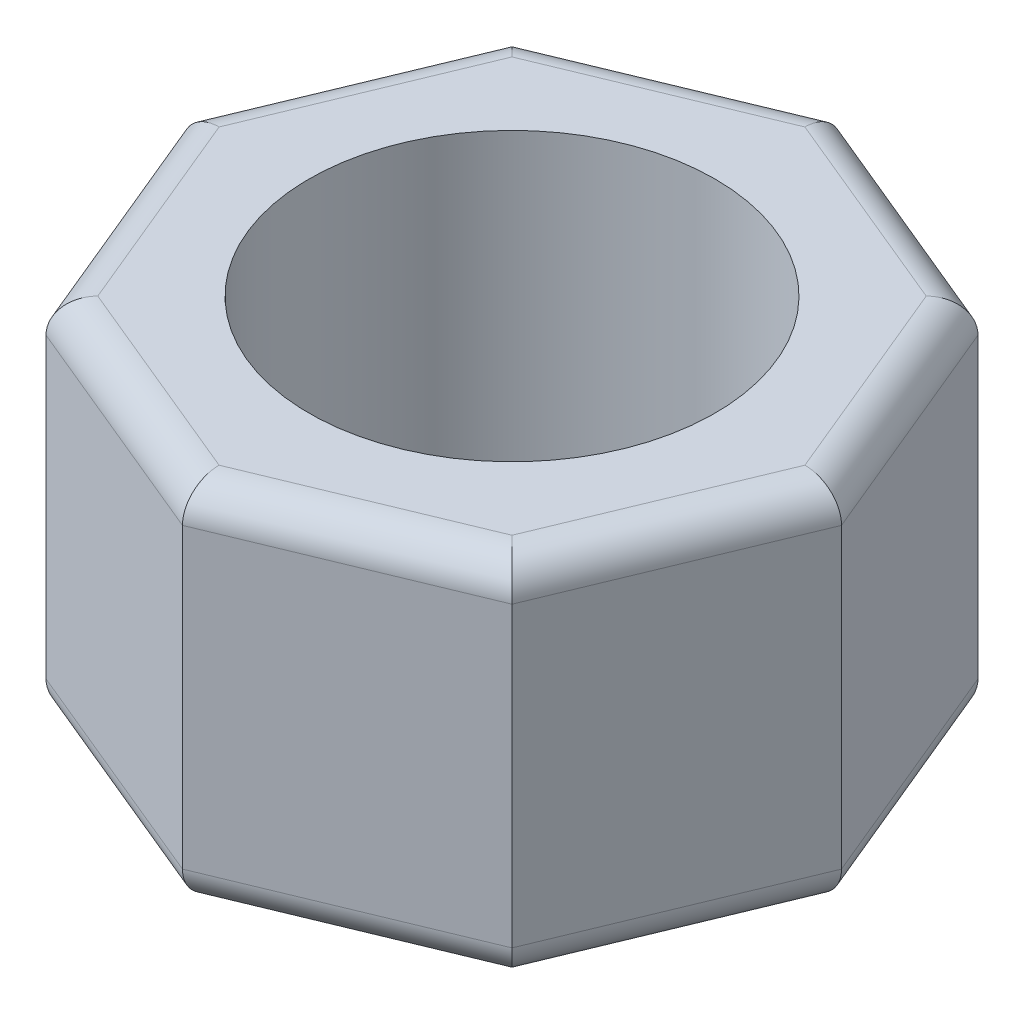
ISO-10303-21;
HEADER;
FILE_DESCRIPTION(('STEP AP214'),'2;1');
FILE_NAME('part.step','',(''),(''),'','','');
FILE_SCHEMA(('AUTOMOTIVE_DESIGN { 1 0 10303 214 1 1 1 1 }'));
ENDSEC;
DATA;
#1=APPLICATION_CONTEXT('core data for automotive mechanical design processes');
#2=APPLICATION_PROTOCOL_DEFINITION('international standard','automotive_design',2000,#1);
#3=PRODUCT_CONTEXT('',#1,'mechanical');
#4=PRODUCT('Part','Part','',(#3));
#5=PRODUCT_RELATED_PRODUCT_CATEGORY('part','',(#4));
#6=PRODUCT_DEFINITION_FORMATION('','',#4);
#7=PRODUCT_DEFINITION_CONTEXT('part definition',#1,'design');
#8=PRODUCT_DEFINITION('design','',#6,#7);
#9=PRODUCT_DEFINITION_SHAPE('','',#8);
#10=(LENGTH_UNIT() NAMED_UNIT(*) SI_UNIT(.MILLI.,.METRE.));
#11=(NAMED_UNIT(*) PLANE_ANGLE_UNIT() SI_UNIT($,.RADIAN.));
#12=(NAMED_UNIT(*) SI_UNIT($,.STERADIAN.) SOLID_ANGLE_UNIT());
#13=UNCERTAINTY_MEASURE_WITH_UNIT(LENGTH_MEASURE(1.E-05),#10,'distance_accuracy_value','');
#14=(GEOMETRIC_REPRESENTATION_CONTEXT(3) GLOBAL_UNCERTAINTY_ASSIGNED_CONTEXT((#13)) GLOBAL_UNIT_ASSIGNED_CONTEXT((#10,
#11,#12)) REPRESENTATION_CONTEXT('',''));
#15=CARTESIAN_POINT('',(0.,0.,0.));
#16=DIRECTION('',(0.,0.,1.));
#17=DIRECTION('',(1.,0.,0.));
#18=AXIS2_PLACEMENT_3D('',#15,#16,#17);
#19=CARTESIAN_POINT('',(0.,10.8,0.));
#20=DIRECTION('',(0.,1.,0.));
#21=DIRECTION('',(0.,0.,1.));
#22=AXIS2_PLACEMENT_3D('',#19,#20,#21);
#23=PLANE('',#22);
#24=DIRECTION('',(0.923879532511292,0.,0.382683432365078));
#25=VECTOR('',#24,1.);
#26=CARTESIAN_POINT('',(0.3826834323652,10.8,8.81765027012026));
#27=LINE('',#26,#25);
#28=CARTESIAN_POINT('',(-6.12293491784136,10.8,6.12293491784151));
#29=VERTEX_POINT('',#28);
#30=CARTESIAN_POINT('',(1.09675449512584E-13,10.8,8.65913760233915));
#31=VERTEX_POINT('',#30);
#32=EDGE_CURVE('E170',#29,#31,#27,.T.);
#33=ORIENTED_EDGE('',*,*,#32,.T.);
#34=DIRECTION('',(0.923879532511282,0.,-0.382683432365101));
#35=VECTOR('',#34,1.);
#36=CARTESIAN_POINT('',(6.5056183502066,10.8,5.96442225006025));
#37=LINE('',#36,#35);
#38=CARTESIAN_POINT('',(6.1229349178415,10.8,6.12293491784137));
#39=VERTEX_POINT('',#38);
#40=EDGE_CURVE('E151',#31,#39,#37,.T.);
#41=ORIENTED_EDGE('',*,*,#40,.T.);
#42=DIRECTION('',(0.382683432365079,0.,-0.923879532511291));
#43=VECTOR('',#42,1.);
#44=CARTESIAN_POINT('',(8.81765027012026,10.8,-0.382683432365206));
#45=LINE('',#44,#43);
#46=CARTESIAN_POINT('',(8.65913760233915,10.8,-1.0994775155675E-13));
#47=VERTEX_POINT('',#46);
#48=EDGE_CURVE('E159',#39,#47,#45,.T.);
#49=ORIENTED_EDGE('',*,*,#48,.T.);
#50=DIRECTION('',(-0.382683432365101,0.,-0.923879532511282));
#51=VECTOR('',#50,1.);
#52=CARTESIAN_POINT('',(5.96442225006025,10.8,-6.5056183502066));
#53=LINE('',#52,#51);
#54=CARTESIAN_POINT('',(6.12293491784136,10.8,-6.12293491784151));
#55=VERTEX_POINT('',#54);
#56=EDGE_CURVE('E165',#47,#55,#53,.T.);
#57=ORIENTED_EDGE('',*,*,#56,.T.);
#58=DIRECTION('',(-0.923879532511292,0.,-0.382683432365078));
#59=VECTOR('',#58,1.);
#60=CARTESIAN_POINT('',(-0.382683432365203,10.8,-8.81765027012026));
#61=LINE('',#60,#59);
#62=CARTESIAN_POINT('',(-1.0795262074916E-13,10.8,-8.65913760233915));
#63=VERTEX_POINT('',#62);
#64=EDGE_CURVE('E310',#55,#63,#61,.T.);
#65=ORIENTED_EDGE('',*,*,#64,.T.);
#66=DIRECTION('',(-0.923879532511282,0.,0.382683432365101));
#67=VECTOR('',#66,1.);
#68=CARTESIAN_POINT('',(-6.5056183502066,10.8,-5.96442225006025));
#69=LINE('',#68,#67);
#70=CARTESIAN_POINT('',(-6.12293491784151,10.8,-6.12293491784136));
#71=VERTEX_POINT('',#70);
#72=EDGE_CURVE('E312',#63,#71,#69,.T.);
#73=ORIENTED_EDGE('',*,*,#72,.T.);
#74=DIRECTION('',(-0.382683432365078,0.,0.923879532511292));
#75=VECTOR('',#74,1.);
#76=CARTESIAN_POINT('',(-8.81765027012026,10.8,0.382683432365201));
#77=LINE('',#76,#75);
#78=CARTESIAN_POINT('',(-8.65913760233915,10.8,1.08557602714497E-13));
#79=VERTEX_POINT('',#78);
#80=EDGE_CURVE('E314',#71,#79,#77,.T.);
#81=ORIENTED_EDGE('',*,*,#80,.T.);
#82=DIRECTION('',(0.382683432365101,0.,0.923879532511282));
#83=VECTOR('',#82,1.);
#84=CARTESIAN_POINT('',(-5.96442225006025,10.8,6.5056183502066));
#85=LINE('',#84,#83);
#86=EDGE_CURVE('E175',#79,#29,#85,.T.);
#87=ORIENTED_EDGE('',*,*,#86,.T.);
#88=EDGE_LOOP('',(#33,#41,#49,#57,#65,#73,#81,#87));
#89=FACE_BOUND('',#88,.T.);
#90=CARTESIAN_POINT('',(0.,10.8,0.));
#91=DIRECTION('',(0.,1.,0.));
#92=DIRECTION('',(0.,0.,1.));
#93=AXIS2_PLACEMENT_3D('',#90,#91,#92);
#94=CIRCLE('',#93,6.);
#95=CARTESIAN_POINT('',(0.,10.8,-6.));
#96=VERTEX_POINT('',#95);
#97=EDGE_CURVE('E339',#96,#96,#94,.T.);
#98=ORIENTED_EDGE('',*,*,#97,.F.);
#99=EDGE_LOOP('',(#98));
#100=FACE_BOUND('',#99,.T.);
#101=ADVANCED_FACE('F34',(#89,#100),#23,.T.);
#102=CARTESIAN_POINT('',(0.,0.,0.));
#103=DIRECTION('',(0.,1.,0.));
#104=DIRECTION('',(0.,0.,1.));
#105=AXIS2_PLACEMENT_3D('',#102,#103,#104);
#106=PLANE('',#105);
#107=DIRECTION('',(0.923879532511292,0.,0.382683432365078));
#108=VECTOR('',#107,1.);
#109=CARTESIAN_POINT('',(-3.06146745892063,0.,7.39103626009033));
#110=LINE('',#109,#108);
#111=CARTESIAN_POINT('',(1.09023625423103E-13,0.,8.65913760233915));
#112=VERTEX_POINT('',#111);
#113=CARTESIAN_POINT('',(-6.12293491784136,0.,6.12293491784151));
#114=VERTEX_POINT('',#113);
#115=EDGE_CURVE('E43',#112,#114,#110,.F.);
#116=ORIENTED_EDGE('',*,*,#115,.T.);
#117=DIRECTION('',(0.382683432365101,0.,0.923879532511282));
#118=VECTOR('',#117,1.);
#119=CARTESIAN_POINT('',(-7.39103626009026,0.,3.06146745892081));
#120=LINE('',#119,#118);
#121=CARTESIAN_POINT('',(-8.65913760233915,0.,1.07241191529115E-13));
#122=VERTEX_POINT('',#121);
#123=EDGE_CURVE('E11',#114,#122,#120,.F.);
#124=ORIENTED_EDGE('',*,*,#123,.T.);
#125=DIRECTION('',(-0.382683432365078,0.,0.923879532511292));
#126=VECTOR('',#125,1.);
#127=CARTESIAN_POINT('',(-7.39103626009034,0.,-3.06146745892063));
#128=LINE('',#127,#126);
#129=CARTESIAN_POINT('',(-6.12293491784151,0.,-6.12293491784136));
#130=VERTEX_POINT('',#129);
#131=EDGE_CURVE('E215',#122,#130,#128,.F.);
#132=ORIENTED_EDGE('',*,*,#131,.T.);
#133=DIRECTION('',(-0.923879532511282,0.,0.382683432365101));
#134=VECTOR('',#133,1.);
#135=CARTESIAN_POINT('',(-3.06146745892081,0.,-7.39103626009026));
#136=LINE('',#135,#134);
#137=CARTESIAN_POINT('',(-1.08744628355322E-13,0.,-8.65913760233916));
#138=VERTEX_POINT('',#137);
#139=EDGE_CURVE('E209',#130,#138,#136,.F.);
#140=ORIENTED_EDGE('',*,*,#139,.T.);
#141=DIRECTION('',(-0.923879532511292,0.,-0.382683432365078));
#142=VECTOR('',#141,1.);
#143=CARTESIAN_POINT('',(3.06146745892063,0.,-7.39103626009033));
#144=LINE('',#143,#142);
#145=CARTESIAN_POINT('',(6.12293491784136,0.,-6.12293491784151));
#146=VERTEX_POINT('',#145);
#147=EDGE_CURVE('E211',#138,#146,#144,.F.);
#148=ORIENTED_EDGE('',*,*,#147,.T.);
#149=DIRECTION('',(-0.382683432365101,0.,-0.923879532511282));
#150=VECTOR('',#149,1.);
#151=CARTESIAN_POINT('',(7.39103626009026,0.,-3.06146745892081));
#152=LINE('',#151,#150);
#153=CARTESIAN_POINT('',(8.65913760233916,0.,-1.10149560319822E-13));
#154=VERTEX_POINT('',#153);
#155=EDGE_CURVE('E213',#146,#154,#152,.F.);
#156=ORIENTED_EDGE('',*,*,#155,.T.);
#157=DIRECTION('',(0.382683432365079,0.,-0.923879532511291));
#158=VECTOR('',#157,1.);
#159=CARTESIAN_POINT('',(7.39103626009033,0.,3.06146745892063));
#160=LINE('',#159,#158);
#161=CARTESIAN_POINT('',(6.12293491784151,0.,6.12293491784136));
#162=VERTEX_POINT('',#161);
#163=EDGE_CURVE('E218',#154,#162,#160,.F.);
#164=ORIENTED_EDGE('',*,*,#163,.T.);
#165=DIRECTION('',(0.923879532511282,0.,-0.382683432365101));
#166=VECTOR('',#165,1.);
#167=CARTESIAN_POINT('',(3.06146745892081,0.,7.39103626009026));
#168=LINE('',#167,#166);
#169=EDGE_CURVE('E54',#162,#112,#168,.F.);
#170=ORIENTED_EDGE('',*,*,#169,.T.);
#171=EDGE_LOOP('',(#116,#124,#132,#140,#148,#156,#164,#170));
#172=FACE_BOUND('',#171,.T.);
#173=CARTESIAN_POINT('',(0.,0.,0.));
#174=DIRECTION('',(0.,1.,0.));
#175=DIRECTION('',(0.,0.,1.));
#176=AXIS2_PLACEMENT_3D('',#173,#174,#175);
#177=CIRCLE('',#176,6.);
#178=CARTESIAN_POINT('',(0.,0.,-6.));
#179=VERTEX_POINT('',#178);
#180=EDGE_CURVE('E239',#179,#179,#177,.T.);
#181=ORIENTED_EDGE('',*,*,#180,.T.);
#182=EDGE_LOOP('',(#181));
#183=FACE_BOUND('',#182,.T.);
#184=ADVANCED_FACE('F270',(#172,#183),#106,.F.);
#185=CARTESIAN_POINT('',(6.8883017825717,10.8,6.88830178257154));
#186=DIRECTION('',(-0.923879532511291,0.,-0.382683432365079));
#187=DIRECTION('',(-0.382683432365079,0.,0.923879532511291));
#188=AXIS2_PLACEMENT_3D('',#185,#186,#187);
#189=PLANE('',#188);
#190=DIRECTION('',(0.,-1.,0.));
#191=VECTOR('',#190,1.);
#192=CARTESIAN_POINT('',(9.74152980263155,10.8,-1.25005390616634E-13));
#193=LINE('',#192,#191);
#194=CARTESIAN_POINT('',(9.74152980263155,9.8,-1.25005390616634E-13));
#195=VERTEX_POINT('',#194);
#196=CARTESIAN_POINT('',(9.74152980263155,1.,-1.25005390616634E-13));
#197=VERTEX_POINT('',#196);
#198=EDGE_CURVE('E166',#195,#197,#193,.T.);
#199=ORIENTED_EDGE('',*,*,#198,.F.);
#200=DIRECTION('',(0.382683432365079,0.,-0.923879532511291));
#201=VECTOR('',#200,1.);
#202=CARTESIAN_POINT('',(6.8883017825717,9.8,6.88830178257154));
#203=LINE('',#202,#201);
#204=CARTESIAN_POINT('',(6.8883017825717,9.8,6.88830178257154));
#205=VERTEX_POINT('',#204);
#206=EDGE_CURVE('E207',#195,#205,#203,.F.);
#207=ORIENTED_EDGE('',*,*,#206,.T.);
#208=DIRECTION('',(0.,-1.,0.));
#209=VECTOR('',#208,1.);
#210=CARTESIAN_POINT('',(6.8883017825717,10.8,6.88830178257154));
#211=LINE('',#210,#209);
#212=CARTESIAN_POINT('',(6.8883017825717,1.,6.88830178257154));
#213=VERTEX_POINT('',#212);
#214=EDGE_CURVE('E335',#205,#213,#211,.T.);
#215=ORIENTED_EDGE('',*,*,#214,.T.);
#216=DIRECTION('',(0.382683432365079,0.,-0.923879532511291));
#217=VECTOR('',#216,1.);
#218=CARTESIAN_POINT('',(6.8883017825717,1.,6.88830178257154));
#219=LINE('',#218,#217);
#220=EDGE_CURVE('E205',#213,#197,#219,.T.);
#221=ORIENTED_EDGE('',*,*,#220,.T.);
#222=EDGE_LOOP('',(#199,#207,#215,#221));
#223=FACE_BOUND('',#222,.T.);
#224=ADVANCED_FACE('F354',(#223),#189,.F.);
#225=CARTESIAN_POINT('',(9.74152980263155,10.8,-1.25005390616634E-13));
#226=DIRECTION('',(-0.923879532511282,0.,0.382683432365101));
#227=DIRECTION('',(0.382683432365101,0.,0.923879532511282));
#228=AXIS2_PLACEMENT_3D('',#225,#226,#227);
#229=PLANE('',#228);
#230=DIRECTION('',(0.,-1.,0.));
#231=VECTOR('',#230,1.);
#232=CARTESIAN_POINT('',(6.88830178257153,10.8,-6.8883017825717));
#233=LINE('',#232,#231);
#234=CARTESIAN_POINT('',(6.88830178257153,9.8,-6.8883017825717));
#235=VERTEX_POINT('',#234);
#236=CARTESIAN_POINT('',(6.88830178257153,1.,-6.8883017825717));
#237=VERTEX_POINT('',#236);
#238=EDGE_CURVE('E299',#235,#237,#233,.T.);
#239=ORIENTED_EDGE('',*,*,#238,.F.);
#240=DIRECTION('',(-0.382683432365101,0.,-0.923879532511282));
#241=VECTOR('',#240,1.);
#242=CARTESIAN_POINT('',(9.74152980263155,9.8,-1.24961782371036E-13));
#243=LINE('',#242,#241);
#244=EDGE_CURVE('E203',#235,#195,#243,.F.);
#245=ORIENTED_EDGE('',*,*,#244,.T.);
#246=ORIENTED_EDGE('',*,*,#198,.T.);
#247=DIRECTION('',(-0.382683432365101,0.,-0.923879532511282));
#248=VECTOR('',#247,1.);
#249=CARTESIAN_POINT('',(9.74152980263155,1.,-1.25005390616634E-13));
#250=LINE('',#249,#248);
#251=EDGE_CURVE('E201',#197,#237,#250,.T.);
#252=ORIENTED_EDGE('',*,*,#251,.T.);
#253=EDGE_LOOP('',(#239,#245,#246,#252));
#254=FACE_BOUND('',#253,.T.);
#255=ADVANCED_FACE('F373',(#254),#229,.F.);
#256=CARTESIAN_POINT('',(6.88830178257153,10.8,-6.8883017825717));
#257=DIRECTION('',(-0.382683432365078,0.,0.923879532511292));
#258=DIRECTION('',(0.923879532511292,0.,0.382683432365078));
#259=AXIS2_PLACEMENT_3D('',#256,#257,#258);
#260=PLANE('',#259);
#261=DIRECTION('',(0.,-1.,0.));
#262=VECTOR('',#261,1.);
#263=CARTESIAN_POINT('',(-1.22646798340849E-13,10.8,-9.74152980263155));
#264=LINE('',#263,#262);
#265=CARTESIAN_POINT('',(-1.22646798340849E-13,9.8,-9.74152980263155));
#266=VERTEX_POINT('',#265);
#267=CARTESIAN_POINT('',(-1.22646798340849E-13,1.,-9.74152980263155));
#268=VERTEX_POINT('',#267);
#269=EDGE_CURVE('E291',#266,#268,#264,.T.);
#270=ORIENTED_EDGE('',*,*,#269,.F.);
#271=DIRECTION('',(-0.923879532511292,0.,-0.382683432365078));
#272=VECTOR('',#271,1.);
#273=CARTESIAN_POINT('',(6.88830178257153,9.8,-6.8883017825717));
#274=LINE('',#273,#272);
#275=EDGE_CURVE('E199',#266,#235,#274,.F.);
#276=ORIENTED_EDGE('',*,*,#275,.T.);
#277=ORIENTED_EDGE('',*,*,#238,.T.);
#278=DIRECTION('',(-0.923879532511292,0.,-0.382683432365078));
#279=VECTOR('',#278,1.);
#280=CARTESIAN_POINT('',(6.88830178257153,1.,-6.8883017825717));
#281=LINE('',#280,#279);
#282=EDGE_CURVE('E197',#237,#268,#281,.T.);
#283=ORIENTED_EDGE('',*,*,#282,.T.);
#284=EDGE_LOOP('',(#270,#276,#277,#283));
#285=FACE_BOUND('',#284,.T.);
#286=ADVANCED_FACE('F370',(#285),#260,.F.);
#287=CARTESIAN_POINT('',(-1.22646798340849E-13,10.8,-9.74152980263155));
#288=DIRECTION('',(0.382683432365101,0.,0.923879532511282));
#289=DIRECTION('',(0.923879532511282,0.,-0.382683432365101));
#290=AXIS2_PLACEMENT_3D('',#287,#288,#289);
#291=PLANE('',#290);
#292=DIRECTION('',(0.,-1.,0.));
#293=VECTOR('',#292,1.);
#294=CARTESIAN_POINT('',(-6.8883017825717,10.8,-6.88830178257153));
#295=LINE('',#294,#293);
#296=CARTESIAN_POINT('',(-6.8883017825717,9.8,-6.88830178257153));
#297=VERTEX_POINT('',#296);
#298=CARTESIAN_POINT('',(-6.8883017825717,1.,-6.88830178257153));
#299=VERTEX_POINT('',#298);
#300=EDGE_CURVE('E288',#297,#299,#295,.T.);
#301=ORIENTED_EDGE('',*,*,#300,.F.);
#302=DIRECTION('',(-0.923879532511282,0.,0.382683432365101));
#303=VECTOR('',#302,1.);
#304=CARTESIAN_POINT('',(-1.21701287541972E-13,9.8,-9.74152980263155));
#305=LINE('',#304,#303);
#306=EDGE_CURVE('E195',#297,#266,#305,.F.);
#307=ORIENTED_EDGE('',*,*,#306,.T.);
#308=ORIENTED_EDGE('',*,*,#269,.T.);
#309=DIRECTION('',(-0.923879532511282,0.,0.382683432365101));
#310=VECTOR('',#309,1.);
#311=CARTESIAN_POINT('',(-1.22646798340849E-13,1.,-9.74152980263155));
#312=LINE('',#311,#310);
#313=EDGE_CURVE('E193',#268,#299,#312,.T.);
#314=ORIENTED_EDGE('',*,*,#313,.T.);
#315=EDGE_LOOP('',(#301,#307,#308,#314));
#316=FACE_BOUND('',#315,.T.);
#317=ADVANCED_FACE('F287',(#316),#291,.F.);
#318=CARTESIAN_POINT('',(-6.8883017825717,10.8,-6.88830178257153));
#319=DIRECTION('',(0.923879532511292,0.,0.382683432365078));
#320=DIRECTION('',(0.382683432365078,0.,-0.923879532511292));
#321=AXIS2_PLACEMENT_3D('',#318,#319,#320);
#322=PLANE('',#321);
#323=DIRECTION('',(0.,-1.,0.));
#324=VECTOR('',#323,1.);
#325=CARTESIAN_POINT('',(-9.74152980263155,10.8,1.21860600915587E-13));
#326=LINE('',#325,#324);
#327=CARTESIAN_POINT('',(-9.74152980263155,9.8,1.21860600915587E-13));
#328=VERTEX_POINT('',#327);
#329=CARTESIAN_POINT('',(-9.74152980263155,1.,1.21860600915587E-13));
#330=VERTEX_POINT('',#329);
#331=EDGE_CURVE('E297',#328,#330,#326,.T.);
#332=ORIENTED_EDGE('',*,*,#331,.F.);
#333=DIRECTION('',(-0.382683432365078,0.,0.923879532511292));
#334=VECTOR('',#333,1.);
#335=CARTESIAN_POINT('',(-6.8883017825717,9.8,-6.88830178257153));
#336=LINE('',#335,#334);
#337=EDGE_CURVE('E191',#328,#297,#336,.F.);
#338=ORIENTED_EDGE('',*,*,#337,.T.);
#339=ORIENTED_EDGE('',*,*,#300,.T.);
#340=DIRECTION('',(-0.382683432365078,0.,0.923879532511292));
#341=VECTOR('',#340,1.);
#342=CARTESIAN_POINT('',(-6.8883017825717,1.,-6.88830178257153));
#343=LINE('',#342,#341);
#344=EDGE_CURVE('E188',#299,#330,#343,.T.);
#345=ORIENTED_EDGE('',*,*,#344,.T.);
#346=EDGE_LOOP('',(#332,#338,#339,#345));
#347=FACE_BOUND('',#346,.T.);
#348=ADVANCED_FACE('F294',(#347),#322,.F.);
#349=CARTESIAN_POINT('',(-9.74152980263155,10.8,1.21860600915587E-13));
#350=DIRECTION('',(0.923879532511282,0.,-0.382683432365101));
#351=DIRECTION('',(-0.382683432365101,0.,-0.923879532511282));
#352=AXIS2_PLACEMENT_3D('',#349,#350,#351);
#353=PLANE('',#352);
#354=DIRECTION('',(0.,-1.,0.));
#355=VECTOR('',#354,1.);
#356=CARTESIAN_POINT('',(-6.88830178257153,10.8,6.8883017825717));
#357=LINE('',#356,#355);
#358=CARTESIAN_POINT('',(-6.88830178257153,9.8,6.8883017825717));
#359=VERTEX_POINT('',#358);
#360=CARTESIAN_POINT('',(-6.88830178257153,1.,6.8883017825717));
#361=VERTEX_POINT('',#360);
#362=EDGE_CURVE('E301',#359,#361,#357,.T.);
#363=ORIENTED_EDGE('',*,*,#362,.F.);
#364=DIRECTION('',(0.382683432365101,0.,0.923879532511282));
#365=VECTOR('',#364,1.);
#366=CARTESIAN_POINT('',(-9.74152980263155,9.8,1.21354795484615E-13));
#367=LINE('',#366,#365);
#368=EDGE_CURVE('E186',#359,#328,#367,.F.);
#369=ORIENTED_EDGE('',*,*,#368,.T.);
#370=ORIENTED_EDGE('',*,*,#331,.T.);
#371=DIRECTION('',(0.382683432365101,0.,0.923879532511282));
#372=VECTOR('',#371,1.);
#373=CARTESIAN_POINT('',(-9.74152980263155,1.,1.21860600915587E-13));
#374=LINE('',#373,#372);
#375=EDGE_CURVE('E184',#330,#361,#374,.T.);
#376=ORIENTED_EDGE('',*,*,#375,.T.);
#377=EDGE_LOOP('',(#363,#369,#370,#376));
#378=FACE_BOUND('',#377,.T.);
#379=ADVANCED_FACE('F362',(#378),#353,.F.);
#380=CARTESIAN_POINT('',(-6.88830178257153,10.8,6.8883017825717));
#381=DIRECTION('',(0.382683432365078,0.,-0.923879532511292));
#382=DIRECTION('',(-0.923879532511292,0.,-0.382683432365078));
#383=AXIS2_PLACEMENT_3D('',#380,#381,#382);
#384=PLANE('',#383);
#385=DIRECTION('',(0.,-1.,0.));
#386=VECTOR('',#385,1.);
#387=CARTESIAN_POINT('',(1.21332391275741E-13,10.8,9.74152980263155));
#388=LINE('',#387,#386);
#389=CARTESIAN_POINT('',(1.21332391275741E-13,9.8,9.74152980263155));
#390=VERTEX_POINT('',#389);
#391=CARTESIAN_POINT('',(1.21332391275741E-13,1.,9.74152980263155));
#392=VERTEX_POINT('',#391);
#393=EDGE_CURVE('E333',#390,#392,#388,.T.);
#394=ORIENTED_EDGE('',*,*,#393,.F.);
#395=DIRECTION('',(0.923879532511292,0.,0.382683432365078));
#396=VECTOR('',#395,1.);
#397=CARTESIAN_POINT('',(-6.88830178257153,9.8,6.8883017825717));
#398=LINE('',#397,#396);
#399=EDGE_CURVE('E182',#390,#359,#398,.F.);
#400=ORIENTED_EDGE('',*,*,#399,.T.);
#401=ORIENTED_EDGE('',*,*,#362,.T.);
#402=DIRECTION('',(0.923879532511292,0.,0.382683432365078));
#403=VECTOR('',#402,1.);
#404=CARTESIAN_POINT('',(-6.88830178257153,1.,6.8883017825717));
#405=LINE('',#404,#403);
#406=EDGE_CURVE('E180',#361,#392,#405,.T.);
#407=ORIENTED_EDGE('',*,*,#406,.T.);
#408=EDGE_LOOP('',(#394,#400,#401,#407));
#409=FACE_BOUND('',#408,.T.);
#410=ADVANCED_FACE('F336',(#409),#384,.F.);
#411=CARTESIAN_POINT('',(1.21332391275741E-13,10.8,9.74152980263155));
#412=DIRECTION('',(-0.382683432365101,0.,-0.923879532511282));
#413=DIRECTION('',(-0.923879532511282,0.,0.382683432365101));
#414=AXIS2_PLACEMENT_3D('',#411,#412,#413);
#415=PLANE('',#414);
#416=ORIENTED_EDGE('',*,*,#214,.F.);
#417=DIRECTION('',(0.923879532511282,0.,-0.382683432365101));
#418=VECTOR('',#417,1.);
#419=CARTESIAN_POINT('',(1.20814728753596E-13,9.8,9.74152980263155));
#420=LINE('',#419,#418);
#421=EDGE_CURVE('E153',#205,#390,#420,.F.);
#422=ORIENTED_EDGE('',*,*,#421,.T.);
#423=ORIENTED_EDGE('',*,*,#393,.T.);
#424=DIRECTION('',(0.923879532511282,0.,-0.382683432365101));
#425=VECTOR('',#424,1.);
#426=CARTESIAN_POINT('',(1.21332391275741E-13,1.,9.74152980263155));
#427=LINE('',#426,#425);
#428=EDGE_CURVE('E172',#392,#213,#427,.T.);
#429=ORIENTED_EDGE('',*,*,#428,.T.);
#430=EDGE_LOOP('',(#416,#422,#423,#429));
#431=FACE_BOUND('',#430,.T.);
#432=ADVANCED_FACE('F332',(#431),#415,.F.);
#433=CARTESIAN_POINT('',(0.,10.8,0.));
#434=DIRECTION('',(0.,-1.,0.));
#435=DIRECTION('',(0.,0.,-1.));
#436=AXIS2_PLACEMENT_3D('',#433,#434,#435);
#437=CYLINDRICAL_SURFACE('',#436,6.);
#438=CARTESIAN_POINT('',(0.,10.8,-6.));
#439=CARTESIAN_POINT('',(0.,10.6875,-6.));
#440=CARTESIAN_POINT('',(0.,10.575,-6.));
#441=CARTESIAN_POINT('',(0.,10.35,-6.));
#442=CARTESIAN_POINT('',(0.,10.2375,-6.));
#443=CARTESIAN_POINT('',(0.,10.0125,-6.));
#444=CARTESIAN_POINT('',(0.,9.9,-6.));
#445=CARTESIAN_POINT('',(0.,9.675,-6.));
#446=CARTESIAN_POINT('',(0.,9.5625,-6.));
#447=CARTESIAN_POINT('',(0.,9.3375,-6.));
#448=CARTESIAN_POINT('',(0.,9.225,-6.));
#449=CARTESIAN_POINT('',(0.,9.,-6.));
#450=CARTESIAN_POINT('',(0.,8.8875,-6.));
#451=CARTESIAN_POINT('',(0.,8.6625,-6.));
#452=CARTESIAN_POINT('',(0.,8.55,-6.));
#453=CARTESIAN_POINT('',(0.,8.325,-6.));
#454=CARTESIAN_POINT('',(0.,8.2125,-6.));
#455=CARTESIAN_POINT('',(0.,7.9875,-6.));
#456=CARTESIAN_POINT('',(0.,7.875,-6.));
#457=CARTESIAN_POINT('',(0.,7.65,-6.));
#458=CARTESIAN_POINT('',(0.,7.5375,-6.));
#459=CARTESIAN_POINT('',(0.,7.3125,-6.));
#460=CARTESIAN_POINT('',(0.,7.2,-6.));
#461=CARTESIAN_POINT('',(0.,6.975,-6.));
#462=CARTESIAN_POINT('',(0.,6.8625,-6.));
#463=CARTESIAN_POINT('',(0.,6.6375,-6.));
#464=CARTESIAN_POINT('',(0.,6.525,-6.));
#465=CARTESIAN_POINT('',(0.,6.3,-6.));
#466=CARTESIAN_POINT('',(0.,6.1875,-6.));
#467=CARTESIAN_POINT('',(0.,5.9625,-6.));
#468=CARTESIAN_POINT('',(0.,5.85,-6.));
#469=CARTESIAN_POINT('',(0.,5.625,-6.));
#470=CARTESIAN_POINT('',(0.,5.5125,-6.));
#471=CARTESIAN_POINT('',(0.,5.2875,-6.));
#472=CARTESIAN_POINT('',(0.,5.175,-6.));
#473=CARTESIAN_POINT('',(0.,4.95,-6.));
#474=CARTESIAN_POINT('',(0.,4.8375,-6.));
#475=CARTESIAN_POINT('',(0.,4.6125,-6.));
#476=CARTESIAN_POINT('',(0.,4.5,-6.));
#477=CARTESIAN_POINT('',(0.,4.275,-6.));
#478=CARTESIAN_POINT('',(0.,4.1625,-6.));
#479=CARTESIAN_POINT('',(0.,3.9375,-6.));
#480=CARTESIAN_POINT('',(0.,3.825,-6.));
#481=CARTESIAN_POINT('',(0.,3.6,-6.));
#482=CARTESIAN_POINT('',(0.,3.4875,-6.));
#483=CARTESIAN_POINT('',(0.,3.2625,-6.));
#484=CARTESIAN_POINT('',(0.,3.15,-6.));
#485=CARTESIAN_POINT('',(0.,2.925,-6.));
#486=CARTESIAN_POINT('',(0.,2.8125,-6.));
#487=CARTESIAN_POINT('',(0.,2.5875,-6.));
#488=CARTESIAN_POINT('',(0.,2.475,-6.));
#489=CARTESIAN_POINT('',(0.,2.25,-6.));
#490=CARTESIAN_POINT('',(0.,2.1375,-6.));
#491=CARTESIAN_POINT('',(0.,1.9125,-6.));
#492=CARTESIAN_POINT('',(0.,1.8,-6.));
#493=CARTESIAN_POINT('',(0.,1.575,-6.));
#494=CARTESIAN_POINT('',(0.,1.4625,-6.));
#495=CARTESIAN_POINT('',(0.,1.2375,-6.));
#496=CARTESIAN_POINT('',(0.,1.125,-6.));
#497=CARTESIAN_POINT('',(0.,0.899999999999998,-6.));
#498=CARTESIAN_POINT('',(0.,0.787499999999998,-6.));
#499=CARTESIAN_POINT('',(0.,0.562499999999999,-6.));
#500=CARTESIAN_POINT('',(0.,0.449999999999999,-6.));
#501=CARTESIAN_POINT('',(0.,0.224999999999999,-6.));
#502=CARTESIAN_POINT('',(0.,0.112499999999998,-6.));
#503=CARTESIAN_POINT('',(0.,0.,-6.));
#504=B_SPLINE_CURVE_WITH_KNOTS('',3,(#438,#439,#440,#441,#442,#443,#444,#445,#446,#447,#448,
#449,#450,#451,#452,#453,#454,#455,#456,#457,#458,#459,#460,#461,#462,#463,#464,#465,#466,#467,
#468,#469,#470,#471,#472,#473,#474,#475,#476,#477,#478,#479,#480,#481,#482,#483,#484,#485,#486,
#487,#488,#489,#490,#491,#492,#493,#494,#495,#496,#497,#498,#499,#500,#501,#502,#503),
.UNSPECIFIED.,.F.,.F.,(4,2,2,2,2,2,2,2,2,2,2,2,2,2,2,2,2,2,2,2,2,2,2,2,2,2,2,2,2,2,2,2,4),(0.,
0.337500000000001,0.675,1.0125,1.35,1.6875,2.025,2.3625,2.7,3.0375,3.375,3.7125,4.05,4.3875,
4.725,5.0625,5.4,5.7375,6.075,6.4125,6.75,7.0875,7.425,7.7625,8.1,8.4375,8.775,9.1125,9.45,
9.7875,10.125,10.4625,10.8),.UNSPECIFIED.);
#505=EDGE_CURVE('BSEAM347',#96,#179,#504,.T.);
#506=ORIENTED_EDGE('',*,*,#97,.T.);
#507=ORIENTED_EDGE('',*,*,#180,.F.);
#508=ORIENTED_EDGE('',*,*,#505,.T.);
#509=ORIENTED_EDGE('',*,*,#505,.F.);
#510=EDGE_LOOP('',(#506,#508,#507,#509));
#511=FACE_BOUND('',#510,.T.);
#512=ADVANCED_FACE('F347',(#511),#437,.F.);
#513=CARTESIAN_POINT('',(-3.06146745892081,9.8,-7.39103626009026));
#514=DIRECTION('',(0.923879532511282,0.,-0.382683432365101));
#515=DIRECTION('',(-0.382683432365101,0.,-0.923879532511282));
#516=AXIS2_PLACEMENT_3D('',#513,#514,#515);
#517=CYLINDRICAL_SURFACE('',#516,1.);
#518=CARTESIAN_POINT('',(-1.047339298621E-13,9.8,-8.65913760233915));
#519=DIRECTION('',(1.,0.,0.));
#520=DIRECTION('',(0.,0.,1.));
#521=AXIS2_PLACEMENT_3D('',#518,#519,#520);
#522=ELLIPSE('',#521,1.08239220029239,1.);
#523=EDGE_CURVE('E233',#266,#63,#522,.T.);
#524=ORIENTED_EDGE('',*,*,#523,.F.);
#525=ORIENTED_EDGE('',*,*,#306,.F.);
#526=CARTESIAN_POINT('',(-6.12293491784151,9.8,-6.12293491784136));
#527=DIRECTION('',(0.707106781186539,0.,-0.707106781186556));
#528=DIRECTION('',(0.707106781186556,0.,0.707106781186539));
#529=AXIS2_PLACEMENT_3D('',#526,#527,#528);
#530=ELLIPSE('',#529,1.08239220029239,1.);
#531=EDGE_CURVE('E236',#71,#297,#530,.F.);
#532=ORIENTED_EDGE('',*,*,#531,.F.);
#533=ORIENTED_EDGE('',*,*,#72,.F.);
#534=EDGE_LOOP('',(#524,#525,#532,#533));
#535=FACE_BOUND('',#534,.T.);
#536=ADVANCED_FACE('F400',(#535),#517,.T.);
#537=CARTESIAN_POINT('',(-7.39103626009033,9.8,-3.06146745892063));
#538=DIRECTION('',(0.382683432365078,0.,-0.923879532511292));
#539=DIRECTION('',(-0.923879532511292,0.,-0.382683432365078));
#540=AXIS2_PLACEMENT_3D('',#537,#538,#539);
#541=CYLINDRICAL_SURFACE('',#540,1.);
#542=ORIENTED_EDGE('',*,*,#531,.T.);
#543=ORIENTED_EDGE('',*,*,#337,.F.);
#544=CARTESIAN_POINT('',(-8.65913760233915,9.8,1.06251812903579E-13));
#545=DIRECTION('',(0.,0.,-1.));
#546=DIRECTION('',(1.,0.,0.));
#547=AXIS2_PLACEMENT_3D('',#544,#545,#546);
#548=ELLIPSE('',#547,1.08239220029239,1.);
#549=EDGE_CURVE('E230',#79,#328,#548,.F.);
#550=ORIENTED_EDGE('',*,*,#549,.F.);
#551=ORIENTED_EDGE('',*,*,#80,.F.);
#552=EDGE_LOOP('',(#542,#543,#550,#551));
#553=FACE_BOUND('',#552,.T.);
#554=ADVANCED_FACE('F396',(#553),#541,.T.);
#555=CARTESIAN_POINT('',(3.06146745892063,9.8,-7.39103626009033));
#556=DIRECTION('',(0.923879532511292,0.,0.382683432365078));
#557=DIRECTION('',(0.382683432365078,0.,-0.923879532511292));
#558=AXIS2_PLACEMENT_3D('',#555,#556,#557);
#559=CYLINDRICAL_SURFACE('',#558,1.);
#560=ORIENTED_EDGE('',*,*,#523,.T.);
#561=ORIENTED_EDGE('',*,*,#64,.F.);
#562=CARTESIAN_POINT('',(6.12293491784136,9.8,-6.12293491784151));
#563=DIRECTION('',(0.707106781186556,0.,0.707106781186539));
#564=DIRECTION('',(-0.707106781186539,0.,0.707106781186556));
#565=AXIS2_PLACEMENT_3D('',#562,#563,#564);
#566=ELLIPSE('',#565,1.08239220029239,1.);
#567=EDGE_CURVE('E227',#235,#55,#566,.T.);
#568=ORIENTED_EDGE('',*,*,#567,.F.);
#569=ORIENTED_EDGE('',*,*,#275,.F.);
#570=EDGE_LOOP('',(#560,#561,#568,#569));
#571=FACE_BOUND('',#570,.T.);
#572=ADVANCED_FACE('F393',(#571),#559,.T.);
#573=CARTESIAN_POINT('',(-7.39103626009026,9.8,3.06146745892081));
#574=DIRECTION('',(-0.382683432365101,0.,-0.923879532511282));
#575=DIRECTION('',(-0.923879532511282,0.,0.382683432365101));
#576=AXIS2_PLACEMENT_3D('',#573,#574,#575);
#577=CYLINDRICAL_SURFACE('',#576,1.);
#578=ORIENTED_EDGE('',*,*,#549,.T.);
#579=ORIENTED_EDGE('',*,*,#368,.F.);
#580=CARTESIAN_POINT('',(-6.12293491784136,9.8,6.12293491784151));
#581=DIRECTION('',(-0.707106781186556,0.,-0.707106781186539));
#582=DIRECTION('',(0.707106781186539,0.,-0.707106781186556));
#583=AXIS2_PLACEMENT_3D('',#580,#581,#582);
#584=ELLIPSE('',#583,1.08239220029239,1.);
#585=EDGE_CURVE('E224',#29,#359,#584,.F.);
#586=ORIENTED_EDGE('',*,*,#585,.F.);
#587=ORIENTED_EDGE('',*,*,#86,.F.);
#588=EDGE_LOOP('',(#578,#579,#586,#587));
#589=FACE_BOUND('',#588,.T.);
#590=ADVANCED_FACE('F321',(#589),#577,.T.);
#591=CARTESIAN_POINT('',(7.39103626009026,9.8,-3.06146745892081));
#592=DIRECTION('',(0.382683432365101,0.,0.923879532511282));
#593=DIRECTION('',(0.923879532511282,0.,-0.382683432365101));
#594=AXIS2_PLACEMENT_3D('',#591,#592,#593);
#595=CYLINDRICAL_SURFACE('',#594,1.);
#596=ORIENTED_EDGE('',*,*,#567,.T.);
#597=ORIENTED_EDGE('',*,*,#56,.F.);
#598=CARTESIAN_POINT('',(8.65913760233915,9.8,-1.12757025938492E-13));
#599=DIRECTION('',(0.,0.,1.));
#600=DIRECTION('',(-1.,0.,0.));
#601=AXIS2_PLACEMENT_3D('',#598,#599,#600);
#602=ELLIPSE('',#601,1.08239220029239,1.);
#603=EDGE_CURVE('E162',#195,#47,#602,.T.);
#604=ORIENTED_EDGE('',*,*,#603,.F.);
#605=ORIENTED_EDGE('',*,*,#244,.F.);
#606=EDGE_LOOP('',(#596,#597,#604,#605));
#607=FACE_BOUND('',#606,.T.);
#608=ADVANCED_FACE('F387',(#607),#595,.T.);
#609=CARTESIAN_POINT('',(-3.06146745892063,9.8,7.39103626009033));
#610=DIRECTION('',(-0.923879532511292,0.,-0.382683432365078));
#611=DIRECTION('',(-0.382683432365078,0.,0.923879532511292));
#612=AXIS2_PLACEMENT_3D('',#609,#610,#611);
#613=CYLINDRICAL_SURFACE('',#612,1.);
#614=ORIENTED_EDGE('',*,*,#585,.T.);
#615=ORIENTED_EDGE('',*,*,#399,.F.);
#616=CARTESIAN_POINT('',(1.06468653338077E-13,9.8,8.65913760233915));
#617=DIRECTION('',(-1.,0.,0.));
#618=DIRECTION('',(0.,0.,-1.));
#619=AXIS2_PLACEMENT_3D('',#616,#617,#618);
#620=ELLIPSE('',#619,1.08239220029239,1.);
#621=EDGE_CURVE('E156',#31,#390,#620,.F.);
#622=ORIENTED_EDGE('',*,*,#621,.F.);
#623=ORIENTED_EDGE('',*,*,#32,.F.);
#624=EDGE_LOOP('',(#614,#615,#622,#623));
#625=FACE_BOUND('',#624,.T.);
#626=ADVANCED_FACE('F324',(#625),#613,.T.);
#627=CARTESIAN_POINT('',(7.39103626009033,9.8,3.06146745892063));
#628=DIRECTION('',(-0.382683432365079,0.,0.923879532511291));
#629=DIRECTION('',(0.923879532511291,0.,0.382683432365079));
#630=AXIS2_PLACEMENT_3D('',#627,#628,#629);
#631=CYLINDRICAL_SURFACE('',#630,1.);
#632=ORIENTED_EDGE('',*,*,#603,.T.);
#633=ORIENTED_EDGE('',*,*,#48,.F.);
#634=CARTESIAN_POINT('',(6.12293491784151,9.8,6.12293491784137));
#635=DIRECTION('',(-0.707106781186539,0.,0.707106781186556));
#636=DIRECTION('',(0.707106781186556,0.,0.707106781186539));
#637=AXIS2_PLACEMENT_3D('',#634,#635,#636);
#638=ELLIPSE('',#637,1.08239220029239,1.);
#639=EDGE_CURVE('E147',#205,#39,#638,.T.);
#640=ORIENTED_EDGE('',*,*,#639,.F.);
#641=ORIENTED_EDGE('',*,*,#206,.F.);
#642=EDGE_LOOP('',(#632,#633,#640,#641));
#643=FACE_BOUND('',#642,.T.);
#644=ADVANCED_FACE('F160',(#643),#631,.T.);
#645=CARTESIAN_POINT('',(3.06146745892081,9.8,7.39103626009026));
#646=DIRECTION('',(-0.923879532511282,0.,0.382683432365101));
#647=DIRECTION('',(0.382683432365101,0.,0.923879532511282));
#648=AXIS2_PLACEMENT_3D('',#645,#646,#647);
#649=CYLINDRICAL_SURFACE('',#648,1.);
#650=ORIENTED_EDGE('',*,*,#621,.T.);
#651=ORIENTED_EDGE('',*,*,#421,.F.);
#652=ORIENTED_EDGE('',*,*,#639,.T.);
#653=ORIENTED_EDGE('',*,*,#40,.F.);
#654=EDGE_LOOP('',(#650,#651,#652,#653));
#655=FACE_BOUND('',#654,.T.);
#656=ADVANCED_FACE('F149',(#655),#649,.T.);
#657=CARTESIAN_POINT('',(5.9644222500604,1.,6.50561835020646));
#658=DIRECTION('',(0.382683432365079,0.,-0.923879532511291));
#659=DIRECTION('',(-0.923879532511291,0.,-0.382683432365079));
#660=AXIS2_PLACEMENT_3D('',#657,#658,#659);
#661=CYLINDRICAL_SURFACE('',#660,1.);
#662=CARTESIAN_POINT('',(6.12293491784151,1.,6.12293491784136));
#663=DIRECTION('',(0.707106781186539,0.,-0.707106781186556));
#664=DIRECTION('',(-0.707106781186556,0.,-0.707106781186539));
#665=AXIS2_PLACEMENT_3D('',#662,#663,#664);
#666=ELLIPSE('',#665,1.08239220029239,1.);
#667=EDGE_CURVE('E255',#162,#213,#666,.F.);
#668=ORIENTED_EDGE('',*,*,#667,.F.);
#669=ORIENTED_EDGE('',*,*,#163,.F.);
#670=CARTESIAN_POINT('',(8.65913760233916,1.,-1.09260473932227E-13));
#671=DIRECTION('',(0.,0.,-1.));
#672=DIRECTION('',(1.,0.,0.));
#673=AXIS2_PLACEMENT_3D('',#670,#671,#672);
#674=ELLIPSE('',#673,1.08239220029239,1.);
#675=EDGE_CURVE('E38',#197,#154,#674,.T.);
#676=ORIENTED_EDGE('',*,*,#675,.F.);
#677=ORIENTED_EDGE('',*,*,#220,.F.);
#678=EDGE_LOOP('',(#668,#669,#676,#677));
#679=FACE_BOUND('',#678,.T.);
#680=ADVANCED_FACE('F36',(#679),#661,.T.);
#681=CARTESIAN_POINT('',(8.81765027012027,1.,0.382683432364976));
#682=DIRECTION('',(-0.382683432365101,0.,-0.923879532511282));
#683=DIRECTION('',(-0.923879532511282,0.,0.382683432365101));
#684=AXIS2_PLACEMENT_3D('',#681,#682,#683);
#685=CYLINDRICAL_SURFACE('',#684,1.);
#686=ORIENTED_EDGE('',*,*,#675,.T.);
#687=ORIENTED_EDGE('',*,*,#155,.F.);
#688=CARTESIAN_POINT('',(6.12293491784136,1.,-6.12293491784151));
#689=DIRECTION('',(-0.707106781186556,0.,-0.707106781186539));
#690=DIRECTION('',(-0.707106781186539,0.,0.707106781186556));
#691=AXIS2_PLACEMENT_3D('',#688,#689,#690);
#692=ELLIPSE('',#691,1.08239220029239,1.);
#693=EDGE_CURVE('E253',#237,#146,#692,.T.);
#694=ORIENTED_EDGE('',*,*,#693,.F.);
#695=ORIENTED_EDGE('',*,*,#251,.F.);
#696=EDGE_LOOP('',(#686,#687,#694,#695));
#697=FACE_BOUND('',#696,.T.);
#698=ADVANCED_FACE('F265',(#697),#685,.T.);
#699=CARTESIAN_POINT('',(-0.38268343236498,1.,8.81765027012026));
#700=DIRECTION('',(0.923879532511282,0.,-0.382683432365101));
#701=DIRECTION('',(-0.382683432365101,0.,-0.923879532511282));
#702=AXIS2_PLACEMENT_3D('',#699,#700,#701);
#703=CYLINDRICAL_SURFACE('',#702,1.);
#704=ORIENTED_EDGE('',*,*,#667,.T.);
#705=ORIENTED_EDGE('',*,*,#428,.F.);
#706=CARTESIAN_POINT('',(1.13461757350608E-13,1.,8.65913760233915));
#707=DIRECTION('',(1.,0.,0.));
#708=DIRECTION('',(0.,0.,-1.));
#709=AXIS2_PLACEMENT_3D('',#706,#707,#708);
#710=ELLIPSE('',#709,1.08239220029239,1.);
#711=EDGE_CURVE('E250',#112,#392,#710,.F.);
#712=ORIENTED_EDGE('',*,*,#711,.F.);
#713=ORIENTED_EDGE('',*,*,#169,.F.);
#714=EDGE_LOOP('',(#704,#705,#712,#713));
#715=FACE_BOUND('',#714,.T.);
#716=ADVANCED_FACE('F421',(#715),#703,.T.);
#717=CARTESIAN_POINT('',(6.50561835020645,1.,-5.96442225006041));
#718=DIRECTION('',(-0.923879532511292,0.,-0.382683432365078));
#719=DIRECTION('',(-0.382683432365078,0.,0.923879532511292));
#720=AXIS2_PLACEMENT_3D('',#717,#718,#719);
#721=CYLINDRICAL_SURFACE('',#720,1.);
#722=ORIENTED_EDGE('',*,*,#693,.T.);
#723=ORIENTED_EDGE('',*,*,#147,.F.);
#724=CARTESIAN_POINT('',(-1.14085173599787E-13,1.,-8.65913760233916));
#725=DIRECTION('',(-1.,0.,0.));
#726=DIRECTION('',(0.,0.,1.));
#727=AXIS2_PLACEMENT_3D('',#724,#725,#726);
#728=ELLIPSE('',#727,1.08239220029239,1.);
#729=EDGE_CURVE('E247',#268,#138,#728,.T.);
#730=ORIENTED_EDGE('',*,*,#729,.F.);
#731=ORIENTED_EDGE('',*,*,#282,.F.);
#732=EDGE_LOOP('',(#722,#723,#730,#731));
#733=FACE_BOUND('',#732,.T.);
#734=ADVANCED_FACE('F276',(#733),#721,.T.);
#735=CARTESIAN_POINT('',(-6.50561835020645,1.,5.96442225006041));
#736=DIRECTION('',(0.923879532511292,0.,0.382683432365078));
#737=DIRECTION('',(0.382683432365078,0.,-0.923879532511292));
#738=AXIS2_PLACEMENT_3D('',#735,#736,#737);
#739=CYLINDRICAL_SURFACE('',#738,1.);
#740=ORIENTED_EDGE('',*,*,#711,.T.);
#741=ORIENTED_EDGE('',*,*,#406,.F.);
#742=CARTESIAN_POINT('',(-6.12293491784136,1.,6.12293491784152));
#743=DIRECTION('',(0.707106781186556,0.,0.707106781186539));
#744=DIRECTION('',(0.707106781186539,0.,-0.707106781186556));
#745=AXIS2_PLACEMENT_3D('',#742,#743,#744);
#746=ELLIPSE('',#745,1.08239220029239,1.);
#747=EDGE_CURVE('E244',#114,#361,#746,.F.);
#748=ORIENTED_EDGE('',*,*,#747,.F.);
#749=ORIENTED_EDGE('',*,*,#115,.F.);
#750=EDGE_LOOP('',(#740,#741,#748,#749));
#751=FACE_BOUND('',#750,.T.);
#752=ADVANCED_FACE('F415',(#751),#739,.T.);
#753=CARTESIAN_POINT('',(0.382683432364979,1.,-8.81765027012027));
#754=DIRECTION('',(-0.923879532511282,0.,0.382683432365101));
#755=DIRECTION('',(0.382683432365101,0.,0.923879532511282));
#756=AXIS2_PLACEMENT_3D('',#753,#754,#755);
#757=CYLINDRICAL_SURFACE('',#756,1.);
#758=ORIENTED_EDGE('',*,*,#729,.T.);
#759=ORIENTED_EDGE('',*,*,#139,.F.);
#760=CARTESIAN_POINT('',(-6.12293491784151,1.,-6.12293491784136));
#761=DIRECTION('',(-0.707106781186539,0.,0.707106781186556));
#762=DIRECTION('',(-0.707106781186556,0.,-0.707106781186539));
#763=AXIS2_PLACEMENT_3D('',#760,#761,#762);
#764=ELLIPSE('',#763,1.08239220029239,1.);
#765=EDGE_CURVE('E242',#299,#130,#764,.T.);
#766=ORIENTED_EDGE('',*,*,#765,.F.);
#767=ORIENTED_EDGE('',*,*,#313,.F.);
#768=EDGE_LOOP('',(#758,#759,#766,#767));
#769=FACE_BOUND('',#768,.T.);
#770=ADVANCED_FACE('F280',(#769),#757,.T.);
#771=CARTESIAN_POINT('',(-8.81765027012026,1.,-0.382683432364979));
#772=DIRECTION('',(0.382683432365101,0.,0.923879532511282));
#773=DIRECTION('',(0.923879532511282,0.,-0.382683432365101));
#774=AXIS2_PLACEMENT_3D('',#771,#772,#773);
#775=CYLINDRICAL_SURFACE('',#774,1.);
#776=ORIENTED_EDGE('',*,*,#747,.T.);
#777=ORIENTED_EDGE('',*,*,#375,.F.);
#778=CARTESIAN_POINT('',(-8.65913760233915,1.,1.09694154801221E-13));
#779=DIRECTION('',(0.,0.,1.));
#780=DIRECTION('',(1.,0.,0.));
#781=AXIS2_PLACEMENT_3D('',#778,#779,#780);
#782=ELLIPSE('',#781,1.08239220029239,1.);
#783=EDGE_CURVE('E240',#122,#330,#782,.F.);
#784=ORIENTED_EDGE('',*,*,#783,.F.);
#785=ORIENTED_EDGE('',*,*,#123,.F.);
#786=EDGE_LOOP('',(#776,#777,#784,#785));
#787=FACE_BOUND('',#786,.T.);
#788=ADVANCED_FACE('F408',(#787),#775,.T.);
#789=CARTESIAN_POINT('',(-5.96442225006041,1.,-6.50561835020645));
#790=DIRECTION('',(-0.382683432365078,0.,0.923879532511292));
#791=DIRECTION('',(0.923879532511292,0.,0.382683432365078));
#792=AXIS2_PLACEMENT_3D('',#789,#790,#791);
#793=CYLINDRICAL_SURFACE('',#792,1.);
#794=ORIENTED_EDGE('',*,*,#765,.T.);
#795=ORIENTED_EDGE('',*,*,#131,.F.);
#796=ORIENTED_EDGE('',*,*,#783,.T.);
#797=ORIENTED_EDGE('',*,*,#344,.F.);
#798=EDGE_LOOP('',(#794,#795,#796,#797));
#799=FACE_BOUND('',#798,.T.);
#800=ADVANCED_FACE('F405',(#799),#793,.T.);
#801=CLOSED_SHELL('',(#101,#184,#224,#255,#286,#317,#348,#379,#410,#432,#512,#536,#554,#572,
#590,#608,#626,#644,#656,#680,#698,#716,#734,#752,#770,#788,#800));
#802=MANIFOLD_SOLID_BREP('B2',#801);
#803=ADVANCED_BREP_SHAPE_REPRESENTATION('',(#18,#802),#14);
#804=SHAPE_DEFINITION_REPRESENTATION(#9,#803);
ENDSEC;
END-ISO-10303-21;
